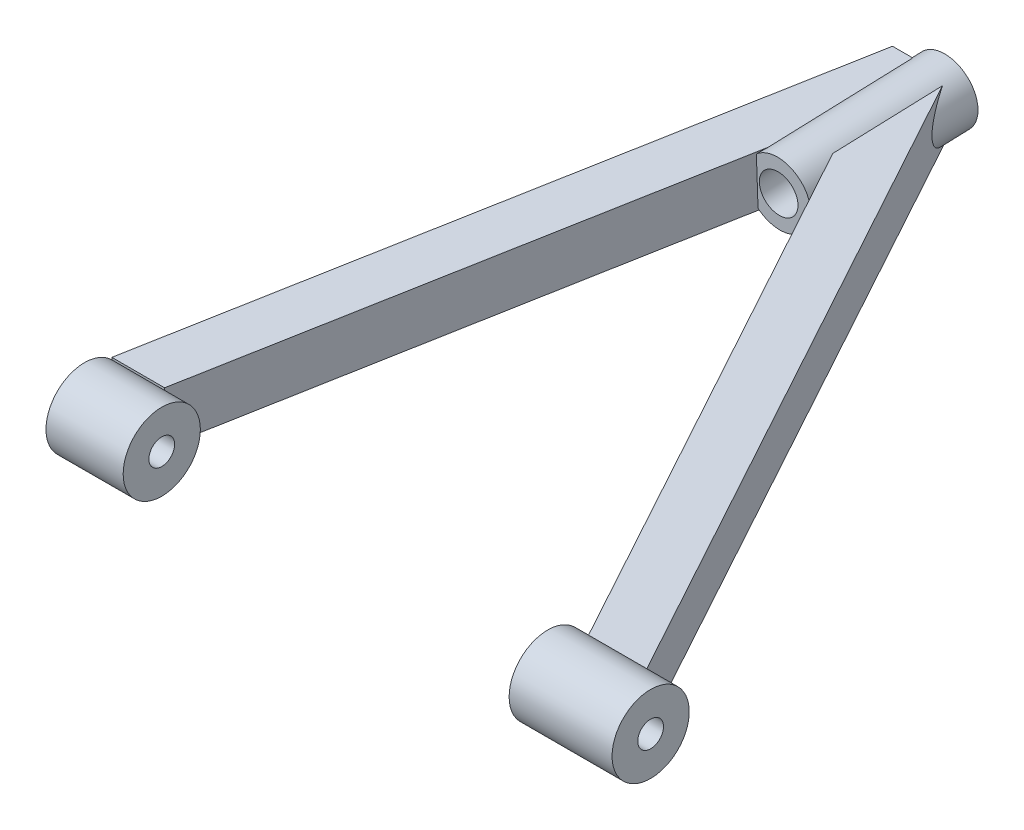
ISO-10303-21;
HEADER;
FILE_DESCRIPTION(('STEP AP214'),'2;1');
FILE_NAME('part.step','',(''),(''),'','','');
FILE_SCHEMA(('AUTOMOTIVE_DESIGN { 1 0 10303 214 1 1 1 1 }'));
ENDSEC;
DATA;
#1=APPLICATION_CONTEXT('core data for automotive mechanical design processes');
#2=APPLICATION_PROTOCOL_DEFINITION('international standard','automotive_design',2000,#1);
#3=PRODUCT_CONTEXT('',#1,'mechanical');
#4=PRODUCT('Part','Part','',(#3));
#5=PRODUCT_RELATED_PRODUCT_CATEGORY('part','',(#4));
#6=PRODUCT_DEFINITION_FORMATION('','',#4);
#7=PRODUCT_DEFINITION_CONTEXT('part definition',#1,'design');
#8=PRODUCT_DEFINITION('design','',#6,#7);
#9=PRODUCT_DEFINITION_SHAPE('','',#8);
#10=(LENGTH_UNIT() NAMED_UNIT(*) SI_UNIT(.MILLI.,.METRE.));
#11=(NAMED_UNIT(*) PLANE_ANGLE_UNIT() SI_UNIT($,.RADIAN.));
#12=(NAMED_UNIT(*) SI_UNIT($,.STERADIAN.) SOLID_ANGLE_UNIT());
#13=UNCERTAINTY_MEASURE_WITH_UNIT(LENGTH_MEASURE(1.E-05),#10,'distance_accuracy_value','');
#14=(GEOMETRIC_REPRESENTATION_CONTEXT(3) GLOBAL_UNCERTAINTY_ASSIGNED_CONTEXT((#13)) GLOBAL_UNIT_ASSIGNED_CONTEXT((#10,
#11,#12)) REPRESENTATION_CONTEXT('',''));
#15=CARTESIAN_POINT('',(0.,0.,0.));
#16=DIRECTION('',(0.,0.,1.));
#17=DIRECTION('',(1.,0.,0.));
#18=AXIS2_PLACEMENT_3D('',#15,#16,#17);
#19=CARTESIAN_POINT('',(0.,1.27434905217525,0.044501249503039));
#20=DIRECTION('',(0.,0.999390827019096,0.0348994967025009));
#21=DIRECTION('',(0.,0.0348994967025009,-0.999390827019096));
#22=AXIS2_PLACEMENT_3D('',#19,#20,#21);
#23=PLANE('',#22);
#24=DIRECTION('',(0.,-0.0348994967025009,0.999390827019096));
#25=VECTOR('',#24,1.);
#26=CARTESIAN_POINT('',(77.4721810515776,19.2390864225726,-514.398268250256));
#27=LINE('',#26,#25);
#28=CARTESIAN_POINT('',(77.4721810515776,18.9437054344602,-505.939663459712));
#29=VERTEX_POINT('',#28);
#30=CARTESIAN_POINT('',(77.4721810515776,17.4552333958201,-463.315401156675));
#31=VERTEX_POINT('',#30);
#32=EDGE_CURVE('E536',#29,#31,#27,.T.);
#33=ORIENTED_EDGE('',*,*,#32,.T.);
#34=DIRECTION('',(-0.468930497806129,0.0308244594001443,-0.882697026691483));
#35=VECTOR('',#34,1.);
#36=CARTESIAN_POINT('',(68.527434382737,18.0432032161414,-480.152653854107));
#37=LINE('',#36,#35);
#38=CARTESIAN_POINT('',(185.044927068506,10.3840965052275,-260.824534159497));
#39=VERTEX_POINT('',#38);
#40=EDGE_CURVE('E440',#39,#31,#37,.T.);
#41=ORIENTED_EDGE('',*,*,#40,.F.);
#42=DIRECTION('',(-1.,0.,0.));
#43=VECTOR('',#42,1.);
#44=CARTESIAN_POINT('',(220.,10.3840965052275,-260.824534159497));
#45=LINE('',#44,#43);
#46=CARTESIAN_POINT('',(207.688955467809,10.3840965052275,-260.824534159497));
#47=VERTEX_POINT('',#46);
#48=EDGE_CURVE('E430',#47,#39,#45,.T.);
#49=ORIENTED_EDGE('',*,*,#48,.F.);
#50=DIRECTION('',(0.468930497806129,-0.0308244594001443,0.882697026691483));
#51=VECTOR('',#50,1.);
#52=CARTESIAN_POINT('',(75.6331881514032,19.0645889390601,-509.401314115161));
#53=LINE('',#52,#51);
#54=EDGE_CURVE('E436',#29,#47,#53,.T.);
#55=ORIENTED_EDGE('',*,*,#54,.F.);
#56=EDGE_LOOP('',(#33,#41,#49,#55));
#57=FACE_BOUND('',#56,.T.);
#58=ADVANCED_FACE('F42',(#57),#23,.T.);
#59=CARTESIAN_POINT('',(0.,-18.7134674882067,-0.65348868454698));
#60=DIRECTION('',(0.,0.999390827019096,0.0348994967025009));
#61=DIRECTION('',(0.,0.0348994967025009,-0.999390827019096));
#62=AXIS2_PLACEMENT_3D('',#59,#60,#61);
#63=PLANE('',#62);
#64=DIRECTION('',(0.468930497806129,-0.0308244594001443,0.882697026691483));
#65=VECTOR('',#64,1.);
#66=CARTESIAN_POINT('',(75.6331881514032,-0.923227601321798,-510.099304049211));
#67=LINE('',#66,#65);
#68=CARTESIAN_POINT('',(77.4721810515776,-1.04411110592169,-506.637653393762));
#69=VERTEX_POINT('',#68);
#70=CARTESIAN_POINT('',(207.688955467809,-9.60372003515441,-261.522524093547));
#71=VERTEX_POINT('',#70);
#72=EDGE_CURVE('E451',#69,#71,#67,.T.);
#73=ORIENTED_EDGE('',*,*,#72,.T.);
#74=DIRECTION('',(-1.,0.,0.));
#75=VECTOR('',#74,1.);
#76=CARTESIAN_POINT('',(220.,-9.60372003515441,-261.522524093547));
#77=LINE('',#76,#75);
#78=CARTESIAN_POINT('',(185.044927068506,-9.60372003515441,-261.522524093547));
#79=VERTEX_POINT('',#78);
#80=EDGE_CURVE('E345',#71,#79,#77,.T.);
#81=ORIENTED_EDGE('',*,*,#80,.T.);
#82=DIRECTION('',(-0.468930497806129,0.0308244594001443,-0.882697026691483));
#83=VECTOR('',#82,1.);
#84=CARTESIAN_POINT('',(68.527434382737,-1.94461332424051,-480.850643788157));
#85=LINE('',#84,#83);
#86=CARTESIAN_POINT('',(77.4721810515776,-2.53258314456182,-464.013391090725));
#87=VERTEX_POINT('',#86);
#88=EDGE_CURVE('E454',#79,#87,#85,.T.);
#89=ORIENTED_EDGE('',*,*,#88,.T.);
#90=DIRECTION('',(0.,-0.0348994967025009,0.999390827019096));
#91=VECTOR('',#90,1.);
#92=CARTESIAN_POINT('',(77.4721810515776,-0.748730117809291,-515.096258184306));
#93=LINE('',#92,#91);
#94=EDGE_CURVE('E220',#69,#87,#93,.T.);
#95=ORIENTED_EDGE('',*,*,#94,.F.);
#96=EDGE_LOOP('',(#73,#81,#89,#95));
#97=FACE_BOUND('',#96,.T.);
#98=ADVANCED_FACE('F263',(#97),#63,.F.);
#99=CARTESIAN_POINT('',(75.6331881514032,19.0645889390601,-509.401314115161));
#100=DIRECTION('',(-0.88323506963169,-0.0163654383618871,0.468644838016943));
#101=DIRECTION('',(-0.468707608630731,0.,-0.883353370747891));
#102=AXIS2_PLACEMENT_3D('',#99,#100,#101);
#103=PLANE('',#102);
#104=ORIENTED_EDGE('',*,*,#54,.T.);
#105=CARTESIAN_POINT('',(213.624863732041,0.,-250.));
#106=DIRECTION('',(0.88323506963169,0.0163654383618871,-0.468644838016943));
#107=DIRECTION('',(-0.468930497806129,0.0308244594001443,-0.882697026691483));
#108=AXIS2_PLACEMENT_3D('',#105,#106,#107);
#109=ELLIPSE('',#108,16.983021299477,15.);
#110=EDGE_CURVE('E428',#47,#71,#109,.F.);
#111=ORIENTED_EDGE('',*,*,#110,.T.);
#112=ORIENTED_EDGE('',*,*,#72,.F.);
#113=CARTESIAN_POINT('',(69.9721810515775,9.44279867852919,-520.406374657945));
#114=DIRECTION('',(0.88323506963169,0.0163654383618871,-0.468644838016943));
#115=DIRECTION('',(0.468930497806129,-0.0308244594001443,0.882697026691484));
#116=AXIS2_PLACEMENT_3D('',#113,#114,#115);
#117=ELLIPSE('',#116,26.6564022994468,12.5);
#118=EDGE_CURVE('E202',#29,#69,#117,.T.);
#119=ORIENTED_EDGE('',*,*,#118,.F.);
#120=EDGE_LOOP('',(#104,#111,#112,#119));
#121=FACE_BOUND('',#120,.T.);
#122=ADVANCED_FACE('F271',(#121),#103,.F.);
#123=CARTESIAN_POINT('',(68.527434382737,18.0432032161414,-480.152653854107));
#124=DIRECTION('',(0.88323506963169,0.0163654383618871,-0.468644838016943));
#125=DIRECTION('',(0.468707608630731,0.,0.883353370747891));
#126=AXIS2_PLACEMENT_3D('',#123,#124,#125);
#127=PLANE('',#126);
#128=ORIENTED_EDGE('',*,*,#88,.F.);
#129=CARTESIAN_POINT('',(190.980835332739,0.,-250.));
#130=DIRECTION('',(-0.88323506963169,-0.0163654383618871,0.468644838016943));
#131=DIRECTION('',(-0.468930497806129,0.0308244594001443,-0.882697026691483));
#132=AXIS2_PLACEMENT_3D('',#129,#130,#131);
#133=ELLIPSE('',#132,16.983021299477,15.);
#134=EDGE_CURVE('E424',#79,#39,#133,.F.);
#135=ORIENTED_EDGE('',*,*,#134,.T.);
#136=ORIENTED_EDGE('',*,*,#40,.T.);
#137=CARTESIAN_POINT('',(69.9721810515775,7.95432663988906,-477.782112354908));
#138=DIRECTION('',(-0.88323506963169,-0.0163654383618871,0.468644838016943));
#139=DIRECTION('',(0.468930497806129,-0.0308244594001443,0.882697026691484));
#140=AXIS2_PLACEMENT_3D('',#137,#138,#139);
#141=ELLIPSE('',#140,26.6564022994468,12.5);
#142=EDGE_CURVE('E59',#87,#31,#141,.T.);
#143=ORIENTED_EDGE('',*,*,#142,.F.);
#144=EDGE_LOOP('',(#128,#135,#136,#143));
#145=FACE_BOUND('',#144,.T.);
#146=ADVANCED_FACE('F302',(#145),#127,.F.);
#147=CARTESIAN_POINT('',(220.,0.,-250.));
#148=DIRECTION('',(1.,0.,0.));
#149=DIRECTION('',(0.,0.,1.));
#150=AXIS2_PLACEMENT_3D('',#147,#148,#149);
#151=PLANE('',#150);
#152=CARTESIAN_POINT('',(220.,0.,-250.));
#153=DIRECTION('',(-1.,0.,0.));
#154=DIRECTION('',(0.,0.,1.));
#155=AXIS2_PLACEMENT_3D('',#152,#153,#154);
#156=CIRCLE('',#155,15.);
#157=CARTESIAN_POINT('',(220.,0.,-235.));
#158=VERTEX_POINT('',#157);
#159=EDGE_CURVE('E421',#158,#158,#156,.T.);
#160=ORIENTED_EDGE('',*,*,#159,.F.);
#161=EDGE_LOOP('',(#160));
#162=FACE_BOUND('',#161,.T.);
#163=CARTESIAN_POINT('',(220.,0.,-250.));
#164=DIRECTION('',(-1.,0.,0.));
#165=DIRECTION('',(0.,0.,1.));
#166=AXIS2_PLACEMENT_3D('',#163,#164,#165);
#167=CIRCLE('',#166,4.99999999999999);
#168=CARTESIAN_POINT('',(220.,0.,-245.));
#169=VERTEX_POINT('',#168);
#170=EDGE_CURVE('E415',#169,#169,#167,.T.);
#171=ORIENTED_EDGE('',*,*,#170,.T.);
#172=EDGE_LOOP('',(#171));
#173=FACE_BOUND('',#172,.T.);
#174=ADVANCED_FACE('F305',(#162,#173),#151,.T.);
#175=CARTESIAN_POINT('',(180.,0.,-250.));
#176=DIRECTION('',(1.,0.,0.));
#177=DIRECTION('',(0.,0.,1.));
#178=AXIS2_PLACEMENT_3D('',#175,#176,#177);
#179=PLANE('',#178);
#180=CARTESIAN_POINT('',(180.,0.,-250.));
#181=DIRECTION('',(-1.,0.,0.));
#182=DIRECTION('',(0.,0.,1.));
#183=AXIS2_PLACEMENT_3D('',#180,#181,#182);
#184=CIRCLE('',#183,15.);
#185=CARTESIAN_POINT('',(180.,0.,-235.));
#186=VERTEX_POINT('',#185);
#187=EDGE_CURVE('E418',#186,#186,#184,.T.);
#188=ORIENTED_EDGE('',*,*,#187,.T.);
#189=EDGE_LOOP('',(#188));
#190=FACE_BOUND('',#189,.T.);
#191=CARTESIAN_POINT('',(180.,0.,-250.));
#192=DIRECTION('',(-1.,0.,0.));
#193=DIRECTION('',(0.,0.,1.));
#194=AXIS2_PLACEMENT_3D('',#191,#192,#193);
#195=CIRCLE('',#194,4.99999999999999);
#196=CARTESIAN_POINT('',(180.,0.,-245.));
#197=VERTEX_POINT('',#196);
#198=EDGE_CURVE('E398',#197,#197,#195,.T.);
#199=ORIENTED_EDGE('',*,*,#198,.F.);
#200=EDGE_LOOP('',(#199));
#201=FACE_BOUND('',#200,.T.);
#202=ADVANCED_FACE('F548',(#190,#201),#179,.F.);
#203=CARTESIAN_POINT('',(220.,0.,-250.));
#204=DIRECTION('',(-1.,0.,0.));
#205=DIRECTION('',(0.,0.,-1.));
#206=AXIS2_PLACEMENT_3D('',#203,#204,#205);
#207=CYLINDRICAL_SURFACE('',#206,15.);
#208=ORIENTED_EDGE('',*,*,#48,.T.);
#209=ORIENTED_EDGE('',*,*,#134,.F.);
#210=ORIENTED_EDGE('',*,*,#80,.F.);
#211=ORIENTED_EDGE('',*,*,#110,.F.);
#212=EDGE_LOOP('',(#208,#209,#210,#211));
#213=FACE_BOUND('',#212,.T.);
#214=ORIENTED_EDGE('',*,*,#159,.T.);
#215=EDGE_LOOP('',(#214));
#216=FACE_BOUND('',#215,.T.);
#217=ORIENTED_EDGE('',*,*,#187,.F.);
#218=EDGE_LOOP('',(#217));
#219=FACE_BOUND('',#218,.T.);
#220=ADVANCED_FACE('F499',(#213,#216,#219),#207,.T.);
#221=CARTESIAN_POINT('',(220.,0.,-250.));
#222=DIRECTION('',(-1.,0.,0.));
#223=DIRECTION('',(0.,0.,-1.));
#224=AXIS2_PLACEMENT_3D('',#221,#222,#223);
#225=CYLINDRICAL_SURFACE('',#224,4.99999999999999);
#226=ORIENTED_EDGE('',*,*,#170,.F.);
#227=EDGE_LOOP('',(#226));
#228=FACE_BOUND('',#227,.T.);
#229=ORIENTED_EDGE('',*,*,#198,.T.);
#230=EDGE_LOOP('',(#229));
#231=FACE_BOUND('',#230,.T.);
#232=ADVANCED_FACE('F492',(#228,#231),#225,.F.);
#233=CARTESIAN_POINT('',(69.9721810515775,6.9767108667191,-449.78685946104));
#234=DIRECTION('',(0.,-0.0348994967025009,0.999390827019096));
#235=DIRECTION('',(0.,0.999390827019096,0.0348994967025009));
#236=AXIS2_PLACEMENT_3D('',#233,#234,#235);
#237=PLANE('',#236);
#238=CARTESIAN_POINT('',(69.9721810515775,6.9767108667191,-449.78685946104));
#239=DIRECTION('',(0.,0.0348994967025009,-0.999390827019096));
#240=DIRECTION('',(0.,0.999390827019096,0.0348994967025009));
#241=AXIS2_PLACEMENT_3D('',#238,#239,#240);
#242=CIRCLE('',#241,12.5);
#243=CARTESIAN_POINT('',(59.579228737345,0.0356885142211256,-450.029245302649));
#244=VERTEX_POINT('',#243);
#245=CARTESIAN_POINT('',(59.579228737345,13.9177332192171,-449.544473619431));
#246=VERTEX_POINT('',#245);
#247=EDGE_CURVE('E212',#244,#246,#242,.T.);
#248=ORIENTED_EDGE('',*,*,#247,.F.);
#249=DIRECTION('',(0.,-0.999390827019096,-0.0348994967025009));
#250=VECTOR('',#249,1.);
#251=CARTESIAN_POINT('',(59.579228737345,16.9706191369101,-449.437864494015));
#252=LINE('',#251,#250);
#253=EDGE_CURVE('E11',#246,#244,#252,.T.);
#254=ORIENTED_EDGE('',*,*,#253,.F.);
#255=EDGE_LOOP('',(#248,#254));
#256=FACE_BOUND('',#255,.T.);
#257=ADVANCED_FACE('F481',(#256),#237,.T.);
#258=CARTESIAN_POINT('',(69.9721810515775,9.24517815238166,-514.747263217281));
#259=DIRECTION('',(0.,-0.0348994967025009,0.999390827019096));
#260=DIRECTION('',(0.,0.999390827019096,0.0348994967025009));
#261=AXIS2_PLACEMENT_3D('',#258,#259,#260);
#262=PLANE('',#261);
#263=CARTESIAN_POINT('',(69.9721810515775,9.24517815238166,-514.747263217281));
#264=DIRECTION('',(0.,-0.0348994967025009,0.999390827019096));
#265=DIRECTION('',(0.,-0.999390827019096,-0.0348994967025009));
#266=AXIS2_PLACEMENT_3D('',#263,#264,#265);
#267=CIRCLE('',#266,7.50000000000001);
#268=CARTESIAN_POINT('',(69.9721810515775,1.74974694973843,-515.00900944255));
#269=VERTEX_POINT('',#268);
#270=EDGE_CURVE('E240',#269,#269,#267,.T.);
#271=ORIENTED_EDGE('',*,*,#270,.T.);
#272=EDGE_LOOP('',(#271));
#273=FACE_BOUND('',#272,.T.);
#274=CARTESIAN_POINT('',(69.9721810515775,9.24517815238166,-514.747263217281));
#275=DIRECTION('',(0.,0.0348994967025009,-0.999390827019096));
#276=DIRECTION('',(0.,0.999390827019096,0.0348994967025009));
#277=AXIS2_PLACEMENT_3D('',#274,#275,#276);
#278=CIRCLE('',#277,12.5);
#279=CARTESIAN_POINT('',(69.9721810515775,21.7375634901204,-514.3110195085));
#280=VERTEX_POINT('',#279);
#281=EDGE_CURVE('E236',#280,#280,#278,.T.);
#282=ORIENTED_EDGE('',*,*,#281,.T.);
#283=EDGE_LOOP('',(#282));
#284=FACE_BOUND('',#283,.T.);
#285=ADVANCED_FACE('F488',(#273,#284),#262,.F.);
#286=CARTESIAN_POINT('',(69.9721810515775,9.24517815238166,-514.747263217281));
#287=DIRECTION('',(0.,-0.0348994967025009,0.999390827019096));
#288=DIRECTION('',(0.,0.999390827019096,0.0348994967025009));
#289=AXIS2_PLACEMENT_3D('',#286,#287,#288);
#290=CYLINDRICAL_SURFACE('',#289,12.5);
#291=CARTESIAN_POINT('',(69.9721810515775,8.27392714118393,-486.934273259335));
#292=DIRECTION('',(0.975722475216309,-0.00764336038540298,0.218877203929003));
#293=DIRECTION('',(-0.2190106192808,-0.0340522233063676,0.975128091447546));
#294=AXIS2_PLACEMENT_3D('',#291,#292,#293);
#295=ELLIPSE('',#294,57.0748580185209,12.5);
#296=CARTESIAN_POINT('',(61.6289919136587,-2.32574408940282,-450.11170834627));
#297=VERTEX_POINT('',#296);
#298=CARTESIAN_POINT('',(62.4721810515775,-2.88609661526257,-453.890089804816));
#299=VERTEX_POINT('',#298);
#300=EDGE_CURVE('E209',#297,#299,#295,.T.);
#301=ORIENTED_EDGE('',*,*,#300,.T.);
#302=DIRECTION('',(0.,-0.0348994967025009,0.999390827019096));
#303=VECTOR('',#302,1.);
#304=CARTESIAN_POINT('',(62.4721810515775,-0.748730117809291,-515.096258184306));
#305=LINE('',#304,#303);
#306=CARTESIAN_POINT('',(62.4721810515775,-0.923227601321798,-510.099304049211));
#307=VERTEX_POINT('',#306);
#308=EDGE_CURVE('E218',#299,#307,#305,.F.);
#309=ORIENTED_EDGE('',*,*,#308,.T.);
#310=CARTESIAN_POINT('',(69.9721810515775,9.07068066886916,-509.750309082186));
#311=DIRECTION('',(0.,0.0348994967025009,-0.999390827019096));
#312=DIRECTION('',(0.,0.999390827019096,0.0348994967025009));
#313=AXIS2_PLACEMENT_3D('',#310,#311,#312);
#314=CIRCLE('',#313,12.5);
#315=CARTESIAN_POINT('',(60.3674946954283,1.07555405271639,-510.029505055806));
#316=VERTEX_POINT('',#315);
#317=EDGE_CURVE('E222',#307,#316,#314,.T.);
#318=ORIENTED_EDGE('',*,*,#317,.T.);
#319=DIRECTION('',(0.,-0.0348994967025009,0.999390827019096));
#320=VECTOR('',#319,1.);
#321=CARTESIAN_POINT('',(60.3674946954283,1.2500515362289,-515.026459190901));
#322=LINE('',#321,#320);
#323=CARTESIAN_POINT('',(60.3674946954283,-0.895854530632472,-453.575749538914));
#324=VERTEX_POINT('',#323);
#325=EDGE_CURVE('E510',#324,#316,#322,.F.);
#326=ORIENTED_EDGE('',*,*,#325,.F.);
#327=CARTESIAN_POINT('',(69.9721810515775,8.59262855225802,-496.060687588475));
#328=DIRECTION('',(0.975722475216309,-0.00764336038540298,0.218877203929003));
#329=DIRECTION('',(-0.2190106192808,-0.0340522233063676,0.975128091447546));
#330=AXIS2_PLACEMENT_3D('',#327,#328,#329);
#331=ELLIPSE('',#330,57.0748580185209,12.5);
#332=EDGE_CURVE('E237',#244,#324,#331,.T.);
#333=ORIENTED_EDGE('',*,*,#332,.F.);
#334=ORIENTED_EDGE('',*,*,#247,.T.);
#335=CARTESIAN_POINT('',(60.3674946954283,15.0943987016731,-453.017357591674));
#336=VERTEX_POINT('',#335);
#337=EDGE_CURVE('E232',#336,#246,#331,.T.);
#338=ORIENTED_EDGE('',*,*,#337,.F.);
#339=DIRECTION('',(0.,-0.0348994967025009,0.999390827019096));
#340=VECTOR('',#339,1.);
#341=CARTESIAN_POINT('',(60.3674946954283,17.2403047685344,-514.468067243661));
#342=LINE('',#341,#340);
#343=CARTESIAN_POINT('',(60.3674946954283,17.0658072850219,-509.471113108566));
#344=VERTEX_POINT('',#343);
#345=EDGE_CURVE('E352',#336,#344,#342,.F.);
#346=ORIENTED_EDGE('',*,*,#345,.T.);
#347=CARTESIAN_POINT('',(62.4721810515775,19.0645889390601,-509.401314115161));
#348=VERTEX_POINT('',#347);
#349=EDGE_CURVE('E229',#344,#348,#314,.T.);
#350=ORIENTED_EDGE('',*,*,#349,.T.);
#351=DIRECTION('',(0.,-0.0348994967025009,0.999390827019096));
#352=VECTOR('',#351,1.);
#353=CARTESIAN_POINT('',(62.4721810515775,19.2390864225726,-514.398268250256));
#354=LINE('',#353,#352);
#355=CARTESIAN_POINT('',(62.4721810515775,17.1017199251193,-453.192099870766));
#356=VERTEX_POINT('',#355);
#357=EDGE_CURVE('E227',#356,#348,#354,.F.);
#358=ORIENTED_EDGE('',*,*,#357,.F.);
#359=CARTESIAN_POINT('',(61.6289919136587,16.279165822841,-449.46201057581));
#360=VERTEX_POINT('',#359);
#361=EDGE_CURVE('E211',#356,#360,#295,.T.);
#362=ORIENTED_EDGE('',*,*,#361,.T.);
#363=EDGE_CURVE('E196',#360,#297,#242,.T.);
#364=ORIENTED_EDGE('',*,*,#363,.T.);
#365=EDGE_LOOP('',(#301,#309,#318,#326,#333,#334,#338,#346,#350,#358,#362,#364));
#366=FACE_BOUND('',#365,.T.);
#367=ORIENTED_EDGE('',*,*,#281,.F.);
#368=EDGE_LOOP('',(#367));
#369=FACE_BOUND('',#368,.T.);
#370=ORIENTED_EDGE('',*,*,#118,.T.);
#371=ORIENTED_EDGE('',*,*,#94,.T.);
#372=ORIENTED_EDGE('',*,*,#142,.T.);
#373=ORIENTED_EDGE('',*,*,#32,.F.);
#374=EDGE_LOOP('',(#370,#371,#372,#373));
#375=FACE_BOUND('',#374,.T.);
#376=ADVANCED_FACE('F206',(#366,#369,#375),#290,.T.);
#377=CARTESIAN_POINT('',(69.9721810515775,6.97671086671911,-449.78685946104));
#378=DIRECTION('',(0.,0.0348994967025009,-0.999390827019096));
#379=DIRECTION('',(0.,0.999390827019096,0.0348994967025009));
#380=AXIS2_PLACEMENT_3D('',#377,#378,#379);
#381=CIRCLE('',#380,7.50000000000001);
#382=CARTESIAN_POINT('',(69.9721810515775,14.4721420693623,-449.525113235771));
#383=VERTEX_POINT('',#382);
#384=EDGE_CURVE('E46',#383,#383,#381,.T.);
#385=ORIENTED_EDGE('',*,*,#384,.T.);
#386=EDGE_LOOP('',(#385));
#387=FACE_BOUND('',#386,.T.);
#388=DIRECTION('',(0.,-0.999390827019096,-0.0348994967025009));
#389=VECTOR('',#388,1.);
#390=CARTESIAN_POINT('',(61.6289919136587,16.9706191369101,-449.437864494015));
#391=LINE('',#390,#389);
#392=EDGE_CURVE('E193',#360,#297,#391,.T.);
#393=ORIENTED_EDGE('',*,*,#392,.T.);
#394=ORIENTED_EDGE('',*,*,#363,.F.);
#395=EDGE_LOOP('',(#393,#394));
#396=FACE_BOUND('',#395,.T.);
#397=ADVANCED_FACE('F195',(#387,#396),#237,.T.);
#398=CARTESIAN_POINT('',(30.,0.,-250.));
#399=DIRECTION('',(-1.,0.,0.));
#400=DIRECTION('',(0.,0.,-1.));
#401=AXIS2_PLACEMENT_3D('',#398,#399,#400);
#402=CYLINDRICAL_SURFACE('',#401,4.99999999999999);
#403=CARTESIAN_POINT('',(30.,0.,-250.));
#404=DIRECTION('',(-1.,0.,0.));
#405=DIRECTION('',(0.,0.,1.));
#406=AXIS2_PLACEMENT_3D('',#403,#404,#405);
#407=CIRCLE('',#406,4.99999999999999);
#408=CARTESIAN_POINT('',(30.,0.,-245.));
#409=VERTEX_POINT('',#408);
#410=EDGE_CURVE('E342',#409,#409,#407,.T.);
#411=ORIENTED_EDGE('',*,*,#410,.F.);
#412=EDGE_LOOP('',(#411));
#413=FACE_BOUND('',#412,.T.);
#414=CARTESIAN_POINT('',(0.,0.,-250.));
#415=DIRECTION('',(-1.,0.,0.));
#416=DIRECTION('',(0.,0.,1.));
#417=AXIS2_PLACEMENT_3D('',#414,#415,#416);
#418=CIRCLE('',#417,4.99999999999999);
#419=CARTESIAN_POINT('',(0.,0.,-245.));
#420=VERTEX_POINT('',#419);
#421=EDGE_CURVE('E337',#420,#420,#418,.T.);
#422=ORIENTED_EDGE('',*,*,#421,.T.);
#423=EDGE_LOOP('',(#422));
#424=FACE_BOUND('',#423,.T.);
#425=ADVANCED_FACE('F44',(#413,#424),#402,.F.);
#426=CARTESIAN_POINT('',(30.,0.,0.));
#427=DIRECTION('',(1.,0.,0.));
#428=DIRECTION('',(0.,0.,1.));
#429=AXIS2_PLACEMENT_3D('',#426,#427,#428);
#430=PLANE('',#429);
#431=ORIENTED_EDGE('',*,*,#410,.T.);
#432=EDGE_LOOP('',(#431));
#433=FACE_BOUND('',#432,.T.);
#434=CARTESIAN_POINT('',(30.,0.,-250.));
#435=DIRECTION('',(-1.,0.,0.));
#436=DIRECTION('',(0.,0.,1.));
#437=AXIS2_PLACEMENT_3D('',#434,#435,#436);
#438=CIRCLE('',#437,15.);
#439=CARTESIAN_POINT('',(30.,0.,-235.));
#440=VERTEX_POINT('',#439);
#441=EDGE_CURVE('E324',#440,#440,#438,.T.);
#442=ORIENTED_EDGE('',*,*,#441,.F.);
#443=EDGE_LOOP('',(#442));
#444=FACE_BOUND('',#443,.T.);
#445=ADVANCED_FACE('F310',(#433,#444),#430,.T.);
#446=CARTESIAN_POINT('',(0.,0.,0.));
#447=DIRECTION('',(1.,0.,0.));
#448=DIRECTION('',(0.,0.,1.));
#449=AXIS2_PLACEMENT_3D('',#446,#447,#448);
#450=PLANE('',#449);
#451=ORIENTED_EDGE('',*,*,#421,.F.);
#452=EDGE_LOOP('',(#451));
#453=FACE_BOUND('',#452,.T.);
#454=DIRECTION('',(0.,-0.999390827019096,-0.0348994967025009));
#455=VECTOR('',#454,1.);
#456=CARTESIAN_POINT('',(0.,9.13835317844566,-261.688196206707));
#457=LINE('',#456,#455);
#458=CARTESIAN_POINT('',(0.,9.41331140360184,-261.678594453907));
#459=VERTEX_POINT('',#458);
#460=CARTESIAN_POINT('',(0.,-8.57572348274193,-262.306785394552));
#461=VERTEX_POINT('',#460);
#462=EDGE_CURVE('E341',#459,#461,#457,.T.);
#463=ORIENTED_EDGE('',*,*,#462,.T.);
#464=CARTESIAN_POINT('',(0.,0.,-250.));
#465=DIRECTION('',(-1.,0.,0.));
#466=DIRECTION('',(0.,0.,1.));
#467=AXIS2_PLACEMENT_3D('',#464,#465,#466);
#468=CIRCLE('',#467,15.);
#469=EDGE_CURVE('E331',#461,#459,#468,.T.);
#470=ORIENTED_EDGE('',*,*,#469,.T.);
#471=EDGE_LOOP('',(#463,#470));
#472=FACE_BOUND('',#471,.T.);
#473=ADVANCED_FACE('F295',(#453,#472),#450,.F.);
#474=CARTESIAN_POINT('',(54.5989572292252,19.0645889390601,-509.401314115161));
#475=DIRECTION('',(0.975722475216309,-0.00764336038540298,0.218877203929003));
#476=DIRECTION('',(-0.21888359771712,0.,0.975750977786038));
#477=AXIS2_PLACEMENT_3D('',#474,#475,#476);
#478=PLANE('',#477);
#479=DIRECTION('',(0.2190106192808,0.0340522233063676,-0.975128091447546));
#480=VECTOR('',#479,1.);
#481=CARTESIAN_POINT('',(54.5989572292252,-0.923227601321798,-510.099304049211));
#482=LINE('',#481,#480);
#483=CARTESIAN_POINT('',(-1.04660367628754,-9.57511430976101,-262.341684891254));
#484=VERTEX_POINT('',#483);
#485=CARTESIAN_POINT('',(54.5989572292252,-0.923227601321798,-510.099304049211));
#486=VERTEX_POINT('',#485);
#487=EDGE_CURVE('E437',#484,#486,#482,.T.);
#488=ORIENTED_EDGE('',*,*,#487,.F.);
#489=DIRECTION('',(0.,-0.999390827019096,-0.0348994967025009));
#490=VECTOR('',#489,1.);
#491=CARTESIAN_POINT('',(-1.04660367628754,10.4127022306209,-261.643694957204));
#492=LINE('',#491,#490);
#493=CARTESIAN_POINT('',(-1.04660367628754,10.4127022306209,-261.643694957204));
#494=VERTEX_POINT('',#493);
#495=EDGE_CURVE('E464',#494,#484,#492,.T.);
#496=ORIENTED_EDGE('',*,*,#495,.F.);
#497=DIRECTION('',(0.2190106192808,0.0340522233063676,-0.975128091447546));
#498=VECTOR('',#497,1.);
#499=CARTESIAN_POINT('',(54.5989572292252,19.0645889390601,-509.401314115161));
#500=LINE('',#499,#498);
#501=CARTESIAN_POINT('',(54.5989572292252,19.0645889390601,-509.401314115161));
#502=VERTEX_POINT('',#501);
#503=EDGE_CURVE('E446',#494,#502,#500,.T.);
#504=ORIENTED_EDGE('',*,*,#503,.T.);
#505=DIRECTION('',(0.,-0.999390827019096,-0.0348994967025009));
#506=VECTOR('',#505,1.);
#507=CARTESIAN_POINT('',(54.5989572292252,19.0645889390601,-509.401314115161));
#508=LINE('',#507,#506);
#509=EDGE_CURVE('E449',#502,#486,#508,.T.);
#510=ORIENTED_EDGE('',*,*,#509,.T.);
#511=EDGE_LOOP('',(#488,#496,#504,#510));
#512=FACE_BOUND('',#511,.T.);
#513=ADVANCED_FACE('F291',(#512),#478,.F.);
#514=CARTESIAN_POINT('',(30.,0.,-250.));
#515=DIRECTION('',(-1.,0.,0.));
#516=DIRECTION('',(0.,0.,-1.));
#517=AXIS2_PLACEMENT_3D('',#514,#515,#516);
#518=CYLINDRICAL_SURFACE('',#517,15.);
#519=ORIENTED_EDGE('',*,*,#441,.T.);
#520=EDGE_LOOP('',(#519));
#521=FACE_BOUND('',#520,.T.);
#522=DIRECTION('',(-1.,0.,0.));
#523=VECTOR('',#522,1.);
#524=CARTESIAN_POINT('',(30.,9.41331140360187,-261.678594453907));
#525=LINE('',#524,#523);
#526=CARTESIAN_POINT('',(19.451028086849,9.41331140360187,-261.678594453907));
#527=VERTEX_POINT('',#526);
#528=EDGE_CURVE('E328',#527,#459,#525,.T.);
#529=ORIENTED_EDGE('',*,*,#528,.T.);
#530=ORIENTED_EDGE('',*,*,#469,.F.);
#531=DIRECTION('',(-1.,0.,0.));
#532=VECTOR('',#531,1.);
#533=CARTESIAN_POINT('',(30.,-8.57572348274196,-262.306785394552));
#534=LINE('',#533,#532);
#535=CARTESIAN_POINT('',(19.451028086849,-8.57572348274196,-262.306785394552));
#536=VERTEX_POINT('',#535);
#537=EDGE_CURVE('E338',#461,#536,#534,.F.);
#538=ORIENTED_EDGE('',*,*,#537,.T.);
#539=CARTESIAN_POINT('',(16.7575086711084,0.,-250.));
#540=DIRECTION('',(0.975722475216309,-0.00764336038540298,0.218877203929003));
#541=DIRECTION('',(-0.2190106192808,-0.0340522233063676,0.975128091447546));
#542=AXIS2_PLACEMENT_3D('',#539,#540,#541);
#543=ELLIPSE('',#542,15.3732238223524,15.);
#544=EDGE_CURVE('E334',#536,#527,#543,.T.);
#545=ORIENTED_EDGE('',*,*,#544,.T.);
#546=EDGE_LOOP('',(#529,#530,#538,#545));
#547=FACE_BOUND('',#546,.T.);
#548=ADVANCED_FACE('F294',(#521,#547),#518,.T.);
#549=CARTESIAN_POINT('',(-1.04660367628754,10.4127022306209,-261.643694957204));
#550=DIRECTION('',(0.,0.0348994967025009,-0.999390827019096));
#551=DIRECTION('',(0.,-0.999390827019096,-0.0348994967025009));
#552=AXIS2_PLACEMENT_3D('',#549,#550,#551);
#553=PLANE('',#552);
#554=DIRECTION('',(0.,-0.999390827019096,-0.0348994967025009));
#555=VECTOR('',#554,1.);
#556=CARTESIAN_POINT('',(19.451028086849,10.4127022306209,-261.643694957204));
#557=LINE('',#556,#555);
#558=CARTESIAN_POINT('',(19.451028086849,10.4127022306209,-261.643694957204));
#559=VERTEX_POINT('',#558);
#560=EDGE_CURVE('E468',#559,#527,#557,.T.);
#561=ORIENTED_EDGE('',*,*,#560,.F.);
#562=DIRECTION('',(-1.,0.,0.));
#563=VECTOR('',#562,1.);
#564=CARTESIAN_POINT('',(-1.04660367628754,10.4127022306209,-261.643694957204));
#565=LINE('',#564,#563);
#566=EDGE_CURVE('E444',#559,#494,#565,.T.);
#567=ORIENTED_EDGE('',*,*,#566,.T.);
#568=ORIENTED_EDGE('',*,*,#495,.T.);
#569=DIRECTION('',(-1.,0.,0.));
#570=VECTOR('',#569,1.);
#571=CARTESIAN_POINT('',(-1.04660367628754,-9.57511430976101,-262.341684891254));
#572=LINE('',#571,#570);
#573=CARTESIAN_POINT('',(19.451028086849,-9.57511430976101,-262.341684891254));
#574=VERTEX_POINT('',#573);
#575=EDGE_CURVE('E458',#574,#484,#572,.T.);
#576=ORIENTED_EDGE('',*,*,#575,.F.);
#577=EDGE_CURVE('E467',#536,#574,#557,.T.);
#578=ORIENTED_EDGE('',*,*,#577,.F.);
#579=ORIENTED_EDGE('',*,*,#537,.F.);
#580=ORIENTED_EDGE('',*,*,#462,.F.);
#581=ORIENTED_EDGE('',*,*,#528,.F.);
#582=EDGE_LOOP('',(#561,#567,#568,#576,#578,#579,#580,#581));
#583=FACE_BOUND('',#582,.T.);
#584=ADVANCED_FACE('F297',(#583),#553,.F.);
#585=CARTESIAN_POINT('',(-1.04660367628754,10.4825012240259,-263.642476611242));
#586=DIRECTION('',(0.,0.0348994967025009,-0.999390827019096));
#587=DIRECTION('',(0.,-0.999390827019096,-0.0348994967025009));
#588=AXIS2_PLACEMENT_3D('',#585,#586,#587);
#589=PLANE('',#588);
#590=DIRECTION('',(0.,-0.999390827019096,-0.0348994967025009));
#591=VECTOR('',#590,1.);
#592=CARTESIAN_POINT('',(17.8501848131588,10.4825012240259,-263.642476611242));
#593=LINE('',#592,#591);
#594=CARTESIAN_POINT('',(17.8501848131588,8.48371956998772,-263.712275604647));
#595=VERTEX_POINT('',#594);
#596=CARTESIAN_POINT('',(17.8501848131588,-7.50653366231782,-264.270667551887));
#597=VERTEX_POINT('',#596);
#598=EDGE_CURVE('E384',#595,#597,#593,.T.);
#599=ORIENTED_EDGE('',*,*,#598,.T.);
#600=DIRECTION('',(-1.,0.,0.));
#601=VECTOR('',#600,1.);
#602=CARTESIAN_POINT('',(-1.04660367628754,-7.50653366231782,-264.270667551887));
#603=LINE('',#602,#601);
#604=CARTESIAN_POINT('',(1.45207940264954,-7.50653366231782,-264.270667551887));
#605=VERTEX_POINT('',#604);
#606=EDGE_CURVE('E389',#597,#605,#603,.T.);
#607=ORIENTED_EDGE('',*,*,#606,.T.);
#608=DIRECTION('',(0.,-0.999390827019096,-0.0348994967025009));
#609=VECTOR('',#608,1.);
#610=CARTESIAN_POINT('',(1.45207940264955,10.4825012240259,-263.642476611242));
#611=LINE('',#610,#609);
#612=CARTESIAN_POINT('',(1.45207940264954,8.48371956998772,-263.712275604647));
#613=VERTEX_POINT('',#612);
#614=EDGE_CURVE('E388',#613,#605,#611,.T.);
#615=ORIENTED_EDGE('',*,*,#614,.F.);
#616=DIRECTION('',(-1.,0.,0.));
#617=VECTOR('',#616,1.);
#618=CARTESIAN_POINT('',(-1.04660367628754,8.48371956998772,-263.712275604647));
#619=LINE('',#618,#617);
#620=EDGE_CURVE('E372',#595,#613,#619,.T.);
#621=ORIENTED_EDGE('',*,*,#620,.F.);
#622=EDGE_LOOP('',(#599,#607,#615,#621));
#623=FACE_BOUND('',#622,.T.);
#624=ADVANCED_FACE('F299',(#623),#589,.T.);
#625=CARTESIAN_POINT('',(56.5504021796578,19.0493022182893,-508.963559707303));
#626=DIRECTION('',(0.975722475216309,-0.00764336038540298,0.218877203929003));
#627=DIRECTION('',(-0.21888359771712,0.,0.975750977786038));
#628=AXIS2_PLACEMENT_3D('',#625,#626,#627);
#629=PLANE('',#628);
#630=DIRECTION('',(0.2190106192808,0.0340522233063676,-0.975128091447546));
#631=VECTOR('',#630,1.);
#632=CARTESIAN_POINT('',(56.5504021796578,1.06026733194559,-509.591750647948));
#633=LINE('',#632,#631);
#634=CARTESIAN_POINT('',(56.6487204055388,1.07555405271639,-510.029505055806));
#635=VERTEX_POINT('',#634);
#636=EDGE_CURVE('E392',#605,#635,#633,.T.);
#637=ORIENTED_EDGE('',*,*,#636,.T.);
#638=DIRECTION('',(0.,-0.999390827019096,-0.0348994967025009));
#639=VECTOR('',#638,1.);
#640=CARTESIAN_POINT('',(56.6487204055388,19.0645889390601,-509.401314115161));
#641=LINE('',#640,#639);
#642=CARTESIAN_POINT('',(56.6487204055388,17.0658072850219,-509.471113108566));
#643=VERTEX_POINT('',#642);
#644=EDGE_CURVE('E383',#643,#635,#641,.T.);
#645=ORIENTED_EDGE('',*,*,#644,.F.);
#646=DIRECTION('',(0.2190106192808,0.0340522233063676,-0.975128091447546));
#647=VECTOR('',#646,1.);
#648=CARTESIAN_POINT('',(56.5504021796578,17.0505205642511,-509.033358700708));
#649=LINE('',#648,#647);
#650=EDGE_CURVE('E380',#613,#643,#649,.T.);
#651=ORIENTED_EDGE('',*,*,#650,.F.);
#652=ORIENTED_EDGE('',*,*,#614,.T.);
#653=EDGE_LOOP('',(#637,#645,#651,#652));
#654=FACE_BOUND('',#653,.T.);
#655=ADVANCED_FACE('F570',(#654),#629,.T.);
#656=CARTESIAN_POINT('',(0.,-16.7146858341685,-0.583689691141978));
#657=DIRECTION('',(0.,0.999390827019096,0.0348994967025009));
#658=DIRECTION('',(0.,0.0348994967025009,-0.999390827019096));
#659=AXIS2_PLACEMENT_3D('',#656,#657,#658);
#660=PLANE('',#659);
#661=ORIENTED_EDGE('',*,*,#325,.T.);
#662=DIRECTION('',(1.,0.,0.));
#663=VECTOR('',#662,1.);
#664=CARTESIAN_POINT('',(54.5989572292252,1.07555405271639,-510.029505055806));
#665=LINE('',#664,#663);
#666=EDGE_CURVE('E402',#635,#316,#665,.T.);
#667=ORIENTED_EDGE('',*,*,#666,.F.);
#668=ORIENTED_EDGE('',*,*,#636,.F.);
#669=ORIENTED_EDGE('',*,*,#606,.F.);
#670=DIRECTION('',(-0.2190106192808,-0.0340522233063676,0.975128091447546));
#671=VECTOR('',#670,1.);
#672=CARTESIAN_POINT('',(66.5759894323044,0.0694550505684899,-481.21859920261));
#673=LINE('',#672,#671);
#674=EDGE_CURVE('E393',#324,#597,#673,.T.);
#675=ORIENTED_EDGE('',*,*,#674,.F.);
#676=EDGE_LOOP('',(#661,#667,#668,#669,#675));
#677=FACE_BOUND('',#676,.T.);
#678=ADVANCED_FACE('F527',(#677),#660,.T.);
#679=CARTESIAN_POINT('',(0.,-0.724432601862944,-0.0252977439019629));
#680=DIRECTION('',(0.,0.999390827019096,0.0348994967025009));
#681=DIRECTION('',(0.,0.0348994967025009,-0.999390827019096));
#682=AXIS2_PLACEMENT_3D('',#679,#680,#681);
#683=PLANE('',#682);
#684=DIRECTION('',(-0.2190106192808,-0.0340522233063676,0.975128091447546));
#685=VECTOR('',#684,1.);
#686=CARTESIAN_POINT('',(66.5759894323044,16.059708282874,-480.66020725537));
#687=LINE('',#686,#685);
#688=EDGE_CURVE('E369',#336,#595,#687,.T.);
#689=ORIENTED_EDGE('',*,*,#688,.T.);
#690=ORIENTED_EDGE('',*,*,#620,.T.);
#691=ORIENTED_EDGE('',*,*,#650,.T.);
#692=DIRECTION('',(1.,0.,0.));
#693=VECTOR('',#692,1.);
#694=CARTESIAN_POINT('',(54.5989572292252,17.0658072850219,-509.471113108566));
#695=LINE('',#694,#693);
#696=EDGE_CURVE('E374',#643,#344,#695,.T.);
#697=ORIENTED_EDGE('',*,*,#696,.T.);
#698=ORIENTED_EDGE('',*,*,#345,.F.);
#699=EDGE_LOOP('',(#689,#690,#691,#697,#698));
#700=FACE_BOUND('',#699,.T.);
#701=ADVANCED_FACE('F516',(#700),#683,.F.);
#702=CARTESIAN_POINT('',(66.5759894323044,18.0584899369122,-480.590408261965));
#703=DIRECTION('',(-0.975722475216309,0.00764336038540298,-0.218877203929003));
#704=DIRECTION('',(0.21888359771712,0.,-0.975750977786038));
#705=AXIS2_PLACEMENT_3D('',#702,#703,#704);
#706=PLANE('',#705);
#707=ORIENTED_EDGE('',*,*,#332,.T.);
#708=ORIENTED_EDGE('',*,*,#674,.T.);
#709=ORIENTED_EDGE('',*,*,#598,.F.);
#710=ORIENTED_EDGE('',*,*,#688,.F.);
#711=ORIENTED_EDGE('',*,*,#337,.T.);
#712=ORIENTED_EDGE('',*,*,#253,.T.);
#713=EDGE_LOOP('',(#707,#708,#709,#710,#711,#712));
#714=FACE_BOUND('',#713,.T.);
#715=ADVANCED_FACE('F288',(#714),#706,.T.);
#716=CARTESIAN_POINT('',(68.527434382737,18.0432032161414,-480.152653854107));
#717=DIRECTION('',(-0.975722475216309,0.00764336038540298,-0.218877203929003));
#718=DIRECTION('',(0.21888359771712,0.,-0.975750977786038));
#719=AXIS2_PLACEMENT_3D('',#716,#717,#718);
#720=PLANE('',#719);
#721=ORIENTED_EDGE('',*,*,#392,.F.);
#722=ORIENTED_EDGE('',*,*,#361,.F.);
#723=DIRECTION('',(-0.2190106192808,-0.0340522233063676,0.975128091447546));
#724=VECTOR('',#723,1.);
#725=CARTESIAN_POINT('',(68.527434382737,18.0432032161414,-480.152653854107));
#726=LINE('',#725,#724);
#727=EDGE_CURVE('E442',#356,#559,#726,.T.);
#728=ORIENTED_EDGE('',*,*,#727,.T.);
#729=ORIENTED_EDGE('',*,*,#560,.T.);
#730=ORIENTED_EDGE('',*,*,#544,.F.);
#731=ORIENTED_EDGE('',*,*,#577,.T.);
#732=DIRECTION('',(-0.2190106192808,-0.0340522233063676,0.975128091447546));
#733=VECTOR('',#732,1.);
#734=CARTESIAN_POINT('',(68.527434382737,-1.94461332424051,-480.850643788157));
#735=LINE('',#734,#733);
#736=EDGE_CURVE('E216',#299,#574,#735,.T.);
#737=ORIENTED_EDGE('',*,*,#736,.F.);
#738=ORIENTED_EDGE('',*,*,#300,.F.);
#739=EDGE_LOOP('',(#721,#722,#728,#729,#730,#731,#737,#738));
#740=FACE_BOUND('',#739,.T.);
#741=ADVANCED_FACE('F214',(#740),#720,.F.);
#742=ORIENTED_EDGE('',*,*,#736,.T.);
#743=ORIENTED_EDGE('',*,*,#575,.T.);
#744=ORIENTED_EDGE('',*,*,#487,.T.);
#745=DIRECTION('',(1.,0.,0.));
#746=VECTOR('',#745,1.);
#747=CARTESIAN_POINT('',(54.5989572292252,-0.923227601321798,-510.099304049211));
#748=LINE('',#747,#746);
#749=EDGE_CURVE('E433',#486,#307,#748,.T.);
#750=ORIENTED_EDGE('',*,*,#749,.T.);
#751=ORIENTED_EDGE('',*,*,#308,.F.);
#752=EDGE_LOOP('',(#742,#743,#744,#750,#751));
#753=FACE_BOUND('',#752,.T.);
#754=ADVANCED_FACE('F274',(#753),#63,.F.);
#755=ORIENTED_EDGE('',*,*,#357,.T.);
#756=DIRECTION('',(1.,0.,0.));
#757=VECTOR('',#756,1.);
#758=CARTESIAN_POINT('',(54.5989572292252,19.0645889390601,-509.401314115161));
#759=LINE('',#758,#757);
#760=EDGE_CURVE('E434',#502,#348,#759,.T.);
#761=ORIENTED_EDGE('',*,*,#760,.F.);
#762=ORIENTED_EDGE('',*,*,#503,.F.);
#763=ORIENTED_EDGE('',*,*,#566,.F.);
#764=ORIENTED_EDGE('',*,*,#727,.F.);
#765=EDGE_LOOP('',(#755,#761,#762,#763,#764));
#766=FACE_BOUND('',#765,.T.);
#767=ADVANCED_FACE('F258',(#766),#23,.T.);
#768=CARTESIAN_POINT('',(54.5989572292252,19.0645889390601,-509.401314115161));
#769=DIRECTION('',(0.,-0.0348994967025009,0.999390827019096));
#770=DIRECTION('',(0.,0.999390827019096,0.0348994967025009));
#771=AXIS2_PLACEMENT_3D('',#768,#769,#770);
#772=PLANE('',#771);
#773=ORIENTED_EDGE('',*,*,#749,.F.);
#774=ORIENTED_EDGE('',*,*,#509,.F.);
#775=ORIENTED_EDGE('',*,*,#760,.T.);
#776=ORIENTED_EDGE('',*,*,#349,.F.);
#777=ORIENTED_EDGE('',*,*,#696,.F.);
#778=ORIENTED_EDGE('',*,*,#644,.T.);
#779=ORIENTED_EDGE('',*,*,#666,.T.);
#780=ORIENTED_EDGE('',*,*,#317,.F.);
#781=EDGE_LOOP('',(#773,#774,#775,#776,#777,#778,#779,#780));
#782=FACE_BOUND('',#781,.T.);
#783=ADVANCED_FACE('F251',(#782),#772,.F.);
#784=CARTESIAN_POINT('',(69.9721810515775,-3.42526541295634,-151.913232073373));
#785=DIRECTION('',(0.,0.0348994967025009,-0.999390827019096));
#786=DIRECTION('',(0.,-0.999390827019096,-0.0348994967025009));
#787=AXIS2_PLACEMENT_3D('',#784,#785,#786);
#788=CYLINDRICAL_SURFACE('',#787,7.50000000000001);
#789=ORIENTED_EDGE('',*,*,#384,.F.);
#790=EDGE_LOOP('',(#789));
#791=FACE_BOUND('',#790,.T.);
#792=ORIENTED_EDGE('',*,*,#270,.F.);
#793=EDGE_LOOP('',(#792));
#794=FACE_BOUND('',#793,.T.);
#795=ADVANCED_FACE('F248',(#791,#794),#788,.F.);
#796=CLOSED_SHELL('',(#58,#98,#122,#146,#174,#202,#220,#232,#257,#285,#376,#397,#425,#445,#473,
#513,#548,#584,#624,#655,#678,#701,#715,#741,#754,#767,#783,#795));
#797=CARTESIAN_POINT('',(220.,0.,-250.));
#798=DIRECTION('',(-1.,0.,0.));
#799=DIRECTION('',(0.,0.,-1.));
#800=AXIS2_PLACEMENT_3D('',#797,#798,#799);
#801=CYLINDRICAL_SURFACE('',#800,9.99999999999999);
#802=DIRECTION('',(-1.,0.,0.));
#803=VECTOR('',#802,1.);
#804=CARTESIAN_POINT('',(208.174918239225,-7.78572963593782,-256.275540935735));
#805=LINE('',#804,#803);
#806=CARTESIAN_POINT('',(208.174918239225,-7.78572963593782,-256.275540935735));
#807=VERTEX_POINT('',#806);
#808=CARTESIAN_POINT('',(190.059695519783,-7.78572963593782,-256.275540935735));
#809=VERTEX_POINT('',#808);
#810=EDGE_CURVE('E387',#807,#809,#805,.T.);
#811=ORIENTED_EDGE('',*,*,#810,.T.);
#812=CARTESIAN_POINT('',(193.245238172669,0.,-250.));
#813=DIRECTION('',(-0.88323506963169,-0.0163654383618871,0.468644838016943));
#814=DIRECTION('',(-0.468930497806129,0.0308244594001443,-0.882697026691483));
#815=AXIS2_PLACEMENT_3D('',#812,#813,#814);
#816=ELLIPSE('',#815,11.3220141996513,10.);
#817=CARTESIAN_POINT('',(190.059695519783,8.20452359636771,-255.717148988495));
#818=VERTEX_POINT('',#817);
#819=EDGE_CURVE('E201',#809,#818,#816,.F.);
#820=ORIENTED_EDGE('',*,*,#819,.T.);
#821=DIRECTION('',(-1.,0.,0.));
#822=VECTOR('',#821,1.);
#823=CARTESIAN_POINT('',(208.174918239225,8.20452359636771,-255.717148988495));
#824=LINE('',#823,#822);
#825=CARTESIAN_POINT('',(208.174918239225,8.20452359636771,-255.717148988495));
#826=VERTEX_POINT('',#825);
#827=EDGE_CURVE('E366',#826,#818,#824,.T.);
#828=ORIENTED_EDGE('',*,*,#827,.F.);
#829=CARTESIAN_POINT('',(211.360460892111,0.,-250.));
#830=DIRECTION('',(0.88323506963169,0.0163654383618871,-0.468644838016943));
#831=DIRECTION('',(-0.468930497806129,0.0308244594001443,-0.882697026691483));
#832=AXIS2_PLACEMENT_3D('',#829,#830,#831);
#833=ELLIPSE('',#832,11.3220141996513,10.);
#834=EDGE_CURVE('E407',#826,#807,#833,.F.);
#835=ORIENTED_EDGE('',*,*,#834,.T.);
#836=EDGE_LOOP('',(#811,#820,#828,#835));
#837=FACE_BOUND('',#836,.T.);
#838=ADVANCED_FACE('F565',(#837),#801,.T.);
#839=DIRECTION('',(0.,-0.0348994967025009,0.999390827019096));
#840=VECTOR('',#839,1.);
#841=CARTESIAN_POINT('',(79.5768674077268,1.2500515362289,-515.026459190901));
#842=LINE('',#841,#840);
#843=CARTESIAN_POINT('',(79.5768674077268,0.667474869502638,-498.343646205812));
#844=VERTEX_POINT('',#843);
#845=CARTESIAN_POINT('',(79.5768674077268,-0.523302761409452,-464.244236363382));
#846=VERTEX_POINT('',#845);
#847=EDGE_CURVE('E529',#844,#846,#842,.T.);
#848=ORIENTED_EDGE('',*,*,#847,.T.);
#849=DIRECTION('',(-0.468930497806129,0.0308244594001443,-0.882697026691483));
#850=VECTOR('',#849,1.);
#851=CARTESIAN_POINT('',(70.2939045220003,0.086899206521461,-481.718134470786));
#852=LINE('',#851,#850);
#853=EDGE_CURVE('E401',#809,#846,#852,.T.);
#854=ORIENTED_EDGE('',*,*,#853,.F.);
#855=ORIENTED_EDGE('',*,*,#810,.F.);
#856=DIRECTION('',(0.468930497806129,-0.0308244594001443,0.882697026691483));
#857=VECTOR('',#856,1.);
#858=CARTESIAN_POINT('',(73.8667180121398,1.04282317599261,-509.092215379772));
#859=LINE('',#858,#857);
#860=EDGE_CURVE('E399',#844,#807,#859,.T.);
#861=ORIENTED_EDGE('',*,*,#860,.F.);
#862=EDGE_LOOP('',(#848,#854,#855,#861));
#863=FACE_BOUND('',#862,.T.);
#864=ADVANCED_FACE('F567',(#863),#660,.T.);
#865=DIRECTION('',(0.468930497806129,-0.0308244594001443,0.882697026691483));
#866=VECTOR('',#865,1.);
#867=CARTESIAN_POINT('',(73.8667180121398,17.0330764082982,-508.533823432532));
#868=LINE('',#867,#866);
#869=CARTESIAN_POINT('',(79.5768674077268,16.6577281018082,-497.785254258571));
#870=VERTEX_POINT('',#869);
#871=EDGE_CURVE('E370',#870,#826,#868,.T.);
#872=ORIENTED_EDGE('',*,*,#871,.T.);
#873=ORIENTED_EDGE('',*,*,#827,.T.);
#874=DIRECTION('',(-0.468930497806129,0.0308244594001443,-0.882697026691483));
#875=VECTOR('',#874,1.);
#876=CARTESIAN_POINT('',(70.2939045220003,16.077152438827,-481.159742523546));
#877=LINE('',#876,#875);
#878=CARTESIAN_POINT('',(79.5768674077268,15.4669504708961,-463.685844416142));
#879=VERTEX_POINT('',#878);
#880=EDGE_CURVE('E363',#818,#879,#877,.T.);
#881=ORIENTED_EDGE('',*,*,#880,.T.);
#882=DIRECTION('',(0.,-0.0348994967025009,0.999390827019096));
#883=VECTOR('',#882,1.);
#884=CARTESIAN_POINT('',(79.5768674077268,17.2403047685344,-514.468067243661));
#885=LINE('',#884,#883);
#886=EDGE_CURVE('E52',#870,#879,#885,.T.);
#887=ORIENTED_EDGE('',*,*,#886,.F.);
#888=EDGE_LOOP('',(#872,#873,#881,#887));
#889=FACE_BOUND('',#888,.T.);
#890=ADVANCED_FACE('F364',(#889),#683,.F.);
#891=CARTESIAN_POINT('',(73.8667180121398,19.0318580623363,-508.464024439127));
#892=DIRECTION('',(-0.88323506963169,-0.0163654383618871,0.468644838016943));
#893=DIRECTION('',(-0.468707608630731,0.,-0.883353370747891));
#894=AXIS2_PLACEMENT_3D('',#891,#892,#893);
#895=PLANE('',#894);
#896=CARTESIAN_POINT('',(69.9721810515775,9.29395147466518,-516.143948427641));
#897=DIRECTION('',(0.88323506963169,0.0163654383618871,-0.468644838016943));
#898=DIRECTION('',(0.468930497806129,-0.0308244594001443,0.882697026691484));
#899=AXIS2_PLACEMENT_3D('',#896,#897,#898);
#900=ELLIPSE('',#899,26.6564022994468,12.5);
#901=EDGE_CURVE('E226',#870,#844,#900,.T.);
#902=ORIENTED_EDGE('',*,*,#901,.T.);
#903=ORIENTED_EDGE('',*,*,#860,.T.);
#904=ORIENTED_EDGE('',*,*,#834,.F.);
#905=ORIENTED_EDGE('',*,*,#871,.F.);
#906=EDGE_LOOP('',(#902,#903,#904,#905));
#907=FACE_BOUND('',#906,.T.);
#908=ADVANCED_FACE('F579',(#907),#895,.T.);
#909=CARTESIAN_POINT('',(70.2939045220003,18.0759340928652,-481.089943530141));
#910=DIRECTION('',(0.88323506963169,0.0163654383618871,-0.468644838016943));
#911=DIRECTION('',(0.468707608630731,0.,0.883353370747891));
#912=AXIS2_PLACEMENT_3D('',#909,#910,#911);
#913=PLANE('',#912);
#914=CARTESIAN_POINT('',(69.9721810515775,8.10317384375308,-482.044538585212));
#915=DIRECTION('',(-0.88323506963169,-0.0163654383618871,0.468644838016943));
#916=DIRECTION('',(0.468930497806129,-0.0308244594001443,0.882697026691484));
#917=AXIS2_PLACEMENT_3D('',#914,#915,#916);
#918=ELLIPSE('',#917,26.6564022994468,12.5);
#919=EDGE_CURVE('E67',#846,#879,#918,.T.);
#920=ORIENTED_EDGE('',*,*,#919,.T.);
#921=ORIENTED_EDGE('',*,*,#880,.F.);
#922=ORIENTED_EDGE('',*,*,#819,.F.);
#923=ORIENTED_EDGE('',*,*,#853,.T.);
#924=EDGE_LOOP('',(#920,#921,#922,#923));
#925=FACE_BOUND('',#924,.T.);
#926=ADVANCED_FACE('F576',(#925),#913,.T.);
#927=ORIENTED_EDGE('',*,*,#901,.F.);
#928=ORIENTED_EDGE('',*,*,#886,.T.);
#929=ORIENTED_EDGE('',*,*,#919,.F.);
#930=ORIENTED_EDGE('',*,*,#847,.F.);
#931=EDGE_LOOP('',(#927,#928,#929,#930));
#932=FACE_BOUND('',#931,.T.);
#933=ADVANCED_FACE('F358',(#932),#290,.T.);
#934=CLOSED_SHELL('',(#838,#864,#890,#908,#926,#933));
#935=ORIENTED_CLOSED_SHELL('',*,#934,.T.);
#936=BREP_WITH_VOIDS('B2',#796,(#935));
#937=ADVANCED_BREP_SHAPE_REPRESENTATION('',(#18,#936),#14);
#938=SHAPE_DEFINITION_REPRESENTATION(#9,#937);
ENDSEC;
END-ISO-10303-21;
